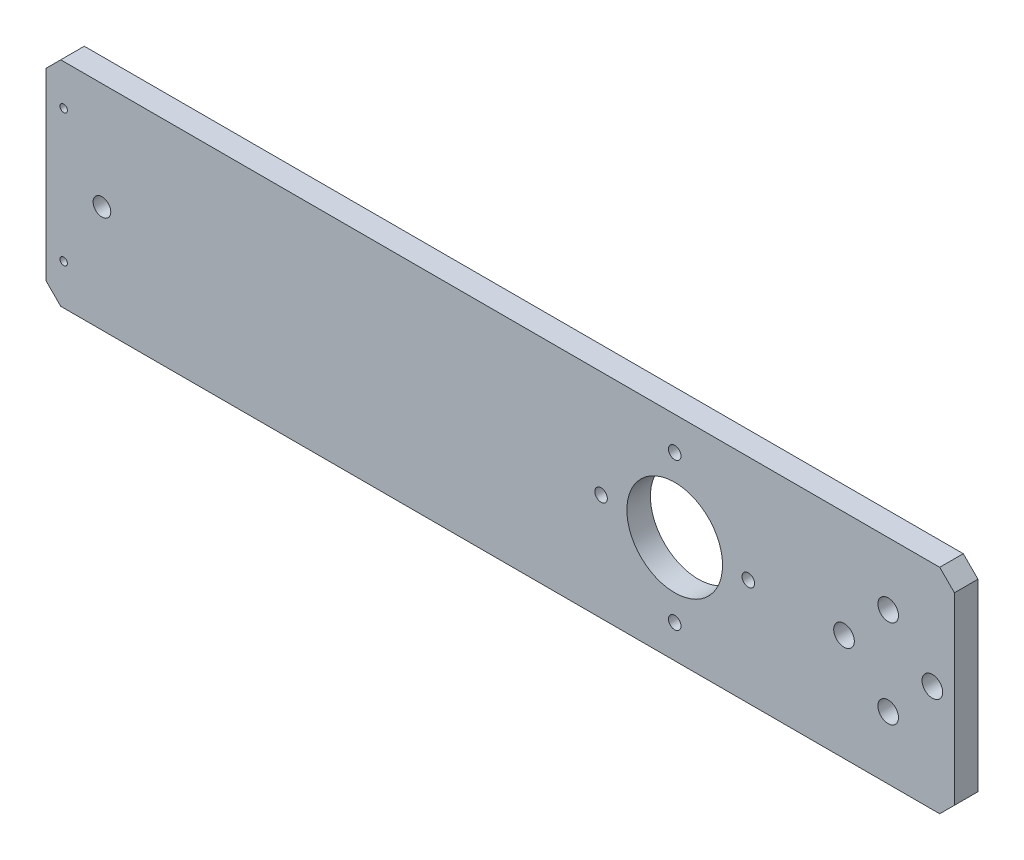
ISO-10303-21;
HEADER;
FILE_DESCRIPTION(('STEP AP214'),'2;1');
FILE_NAME('part.step','',(''),(''),'','','');
FILE_SCHEMA(('AUTOMOTIVE_DESIGN { 1 0 10303 214 1 1 1 1 }'));
ENDSEC;
DATA;
#1=APPLICATION_CONTEXT('core data for automotive mechanical design processes');
#2=APPLICATION_PROTOCOL_DEFINITION('international standard','automotive_design',2000,#1);
#3=PRODUCT_CONTEXT('',#1,'mechanical');
#4=PRODUCT('Part','Part','',(#3));
#5=PRODUCT_RELATED_PRODUCT_CATEGORY('part','',(#4));
#6=PRODUCT_DEFINITION_FORMATION('','',#4);
#7=PRODUCT_DEFINITION_CONTEXT('part definition',#1,'design');
#8=PRODUCT_DEFINITION('design','',#6,#7);
#9=PRODUCT_DEFINITION_SHAPE('','',#8);
#10=(LENGTH_UNIT() NAMED_UNIT(*) SI_UNIT(.MILLI.,.METRE.));
#11=(NAMED_UNIT(*) PLANE_ANGLE_UNIT() SI_UNIT($,.RADIAN.));
#12=(NAMED_UNIT(*) SI_UNIT($,.STERADIAN.) SOLID_ANGLE_UNIT());
#13=UNCERTAINTY_MEASURE_WITH_UNIT(LENGTH_MEASURE(1.E-05),#10,'distance_accuracy_value','');
#14=(GEOMETRIC_REPRESENTATION_CONTEXT(3) GLOBAL_UNCERTAINTY_ASSIGNED_CONTEXT((#13)) GLOBAL_UNIT_ASSIGNED_CONTEXT((#10,
#11,#12)) REPRESENTATION_CONTEXT('',''));
#15=CARTESIAN_POINT('',(0.,0.,0.));
#16=DIRECTION('',(0.,0.,1.));
#17=DIRECTION('',(1.,0.,0.));
#18=AXIS2_PLACEMENT_3D('',#15,#16,#17);
#19=CARTESIAN_POINT('',(575.187566056447,817.177968159028,16.));
#20=DIRECTION('',(0.,0.,1.));
#21=DIRECTION('',(1.,0.,0.));
#22=AXIS2_PLACEMENT_3D('',#19,#20,#21);
#23=PLANE('',#22);
#24=CARTESIAN_POINT('',(1014.68756605645,817.177968158969,16.));
#25=DIRECTION('',(0.,0.,1.));
#26=DIRECTION('',(1.,0.,0.));
#27=AXIS2_PLACEMENT_3D('',#24,#25,#26);
#28=CIRCLE('',#27,4.25000000000009);
#29=CARTESIAN_POINT('',(1018.93756605645,817.177968158969,16.));
#30=VERTEX_POINT('',#29);
#31=EDGE_CURVE('E187',#30,#30,#28,.T.);
#32=ORIENTED_EDGE('',*,*,#31,.F.);
#33=EDGE_LOOP('',(#32));
#34=FACE_BOUND('',#33,.T.);
#35=CARTESIAN_POINT('',(1064.68756605645,767.177968158969,16.));
#36=DIRECTION('',(0.,0.,1.));
#37=DIRECTION('',(1.,0.,0.));
#38=AXIS2_PLACEMENT_3D('',#35,#36,#37);
#39=CIRCLE('',#38,4.25000000000009);
#40=CARTESIAN_POINT('',(1068.93756605645,767.177968158969,16.));
#41=VERTEX_POINT('',#40);
#42=EDGE_CURVE('E177',#41,#41,#39,.T.);
#43=ORIENTED_EDGE('',*,*,#42,.F.);
#44=EDGE_LOOP('',(#43));
#45=FACE_BOUND('',#44,.T.);
#46=CARTESIAN_POINT('',(1114.68756605645,817.177968158969,16.));
#47=DIRECTION('',(0.,0.,1.));
#48=DIRECTION('',(1.,0.,0.));
#49=AXIS2_PLACEMENT_3D('',#46,#47,#48);
#50=CIRCLE('',#49,4.25000000000009);
#51=CARTESIAN_POINT('',(1118.93756605645,817.177968158969,16.));
#52=VERTEX_POINT('',#51);
#53=EDGE_CURVE('E174',#52,#52,#50,.T.);
#54=ORIENTED_EDGE('',*,*,#53,.F.);
#55=EDGE_LOOP('',(#54));
#56=FACE_BOUND('',#55,.T.);
#57=CARTESIAN_POINT('',(1064.68756605645,867.177968158969,16.));
#58=DIRECTION('',(0.,0.,1.));
#59=DIRECTION('',(1.,0.,0.));
#60=AXIS2_PLACEMENT_3D('',#57,#58,#59);
#61=CIRCLE('',#60,4.25000000000009);
#62=CARTESIAN_POINT('',(1068.93756605645,867.177968158969,16.));
#63=VERTEX_POINT('',#62);
#64=EDGE_CURVE('E171',#63,#63,#61,.T.);
#65=ORIENTED_EDGE('',*,*,#64,.F.);
#66=EDGE_LOOP('',(#65));
#67=FACE_BOUND('',#66,.T.);
#68=CARTESIAN_POINT('',(649.687566056466,772.177968159026,16.));
#69=DIRECTION('',(0.,0.,1.));
#70=DIRECTION('',(1.,0.,0.));
#71=AXIS2_PLACEMENT_3D('',#68,#69,#70);
#72=CIRCLE('',#71,2.49999999999995);
#73=CARTESIAN_POINT('',(652.187566056466,772.177968159026,16.));
#74=VERTEX_POINT('',#73);
#75=EDGE_CURVE('E194',#74,#74,#72,.T.);
#76=ORIENTED_EDGE('',*,*,#75,.F.);
#77=EDGE_LOOP('',(#76));
#78=FACE_BOUND('',#77,.T.);
#79=CARTESIAN_POINT('',(649.687566056466,862.177968159026,16.));
#80=DIRECTION('',(0.,0.,1.));
#81=DIRECTION('',(1.,0.,0.));
#82=AXIS2_PLACEMENT_3D('',#79,#80,#81);
#83=CIRCLE('',#82,2.49999999999995);
#84=CARTESIAN_POINT('',(652.187566056466,862.177968159026,16.));
#85=VERTEX_POINT('',#84);
#86=EDGE_CURVE('E200',#85,#85,#83,.T.);
#87=ORIENTED_EDGE('',*,*,#86,.F.);
#88=EDGE_LOOP('',(#87));
#89=FACE_BOUND('',#88,.T.);
#90=CARTESIAN_POINT('',(675.687566056447,817.177968158968,16.));
#91=DIRECTION('',(0.,0.,1.));
#92=DIRECTION('',(1.,0.,0.));
#93=AXIS2_PLACEMENT_3D('',#90,#91,#92);
#94=CIRCLE('',#93,6.00000000000001);
#95=CARTESIAN_POINT('',(681.687566056447,817.177968158968,16.));
#96=VERTEX_POINT('',#95);
#97=EDGE_CURVE('E166',#96,#96,#94,.T.);
#98=ORIENTED_EDGE('',*,*,#97,.F.);
#99=EDGE_LOOP('',(#98));
#100=FACE_BOUND('',#99,.T.);
#101=CARTESIAN_POINT('',(1179.68756605645,817.177968158969,16.));
#102=DIRECTION('',(0.,0.,1.));
#103=DIRECTION('',(1.,0.,0.));
#104=AXIS2_PLACEMENT_3D('',#101,#102,#103);
#105=CIRCLE('',#104,6.9999999999999);
#106=CARTESIAN_POINT('',(1186.68756605645,817.177968158969,16.));
#107=VERTEX_POINT('',#106);
#108=EDGE_CURVE('E211',#107,#107,#105,.T.);
#109=ORIENTED_EDGE('',*,*,#108,.F.);
#110=EDGE_LOOP('',(#109));
#111=FACE_BOUND('',#110,.T.);
#112=DIRECTION('',(-0.707106781186547,-0.707106781186547,0.));
#113=VECTOR('',#112,1.);
#114=CARTESIAN_POINT('',(647.687566056447,889.677968159028,16.));
#115=LINE('',#114,#113);
#116=CARTESIAN_POINT('',(647.687566056447,889.677968159028,16.));
#117=VERTEX_POINT('',#116);
#118=CARTESIAN_POINT('',(637.687566056447,879.677968159028,16.));
#119=VERTEX_POINT('',#118);
#120=EDGE_CURVE('E150',#117,#119,#115,.T.);
#121=ORIENTED_EDGE('',*,*,#120,.T.);
#122=DIRECTION('',(0.,-1.,0.));
#123=VECTOR('',#122,1.);
#124=CARTESIAN_POINT('',(637.687566056447,879.677968159028,16.));
#125=LINE('',#124,#123);
#126=CARTESIAN_POINT('',(637.687566056447,754.677968159028,16.));
#127=VERTEX_POINT('',#126);
#128=EDGE_CURVE('E98',#119,#127,#125,.T.);
#129=ORIENTED_EDGE('',*,*,#128,.T.);
#130=DIRECTION('',(0.707106781186547,-0.707106781186547,0.));
#131=VECTOR('',#130,1.);
#132=CARTESIAN_POINT('',(637.687566056447,754.677968159028,16.));
#133=LINE('',#132,#131);
#134=CARTESIAN_POINT('',(647.687566056447,744.677968159028,16.));
#135=VERTEX_POINT('',#134);
#136=EDGE_CURVE('E235',#127,#135,#133,.T.);
#137=ORIENTED_EDGE('',*,*,#136,.T.);
#138=DIRECTION('',(1.,0.,0.));
#139=VECTOR('',#138,1.);
#140=CARTESIAN_POINT('',(647.687566056447,744.677968159028,16.));
#141=LINE('',#140,#139);
#142=CARTESIAN_POINT('',(1244.68756605645,744.677968159028,16.));
#143=VERTEX_POINT('',#142);
#144=EDGE_CURVE('E237',#135,#143,#141,.T.);
#145=ORIENTED_EDGE('',*,*,#144,.T.);
#146=DIRECTION('',(0.707106781186547,0.707106781186547,0.));
#147=VECTOR('',#146,1.);
#148=CARTESIAN_POINT('',(1244.68756605645,744.677968159028,16.));
#149=LINE('',#148,#147);
#150=CARTESIAN_POINT('',(1254.68756605645,754.677968159028,16.));
#151=VERTEX_POINT('',#150);
#152=EDGE_CURVE('E117',#143,#151,#149,.T.);
#153=ORIENTED_EDGE('',*,*,#152,.T.);
#154=DIRECTION('',(0.,1.,0.));
#155=VECTOR('',#154,1.);
#156=CARTESIAN_POINT('',(1254.68756605645,754.677968159028,16.));
#157=LINE('',#156,#155);
#158=CARTESIAN_POINT('',(1254.68756605645,879.677968159028,16.));
#159=VERTEX_POINT('',#158);
#160=EDGE_CURVE('E111',#151,#159,#157,.T.);
#161=ORIENTED_EDGE('',*,*,#160,.T.);
#162=DIRECTION('',(-0.707106781186547,0.707106781186547,0.));
#163=VECTOR('',#162,1.);
#164=CARTESIAN_POINT('',(1254.68756605645,879.677968159028,16.));
#165=LINE('',#164,#163);
#166=CARTESIAN_POINT('',(1244.68756605645,889.677968159028,16.));
#167=VERTEX_POINT('',#166);
#168=EDGE_CURVE('E115',#159,#167,#165,.T.);
#169=ORIENTED_EDGE('',*,*,#168,.T.);
#170=DIRECTION('',(-1.,0.,0.));
#171=VECTOR('',#170,1.);
#172=CARTESIAN_POINT('',(1244.68756605645,889.677968159028,16.));
#173=LINE('',#172,#171);
#174=EDGE_CURVE('E55',#167,#117,#173,.T.);
#175=ORIENTED_EDGE('',*,*,#174,.T.);
#176=EDGE_LOOP('',(#121,#129,#137,#145,#153,#161,#169,#175));
#177=FACE_BOUND('',#176,.T.);
#178=CARTESIAN_POINT('',(1209.68756605645,787.177968158969,16.));
#179=DIRECTION('',(0.,0.,1.));
#180=DIRECTION('',(1.,0.,0.));
#181=AXIS2_PLACEMENT_3D('',#178,#179,#180);
#182=CIRCLE('',#181,6.9999999999999);
#183=CARTESIAN_POINT('',(1216.68756605645,787.177968158969,16.));
#184=VERTEX_POINT('',#183);
#185=EDGE_CURVE('E139',#184,#184,#182,.T.);
#186=ORIENTED_EDGE('',*,*,#185,.F.);
#187=EDGE_LOOP('',(#186));
#188=FACE_BOUND('',#187,.T.);
#189=CARTESIAN_POINT('',(1064.68756605645,817.177968158969,16.));
#190=DIRECTION('',(0.,0.,1.));
#191=DIRECTION('',(1.,0.,0.));
#192=AXIS2_PLACEMENT_3D('',#189,#190,#191);
#193=CIRCLE('',#192,32.5);
#194=CARTESIAN_POINT('',(1097.18756605645,817.177968158969,16.));
#195=VERTEX_POINT('',#194);
#196=EDGE_CURVE('E223',#195,#195,#193,.T.);
#197=ORIENTED_EDGE('',*,*,#196,.F.);
#198=EDGE_LOOP('',(#197));
#199=FACE_BOUND('',#198,.T.);
#200=CARTESIAN_POINT('',(1239.68756605645,817.177968158969,16.));
#201=DIRECTION('',(0.,0.,1.));
#202=DIRECTION('',(1.,0.,0.));
#203=AXIS2_PLACEMENT_3D('',#200,#201,#202);
#204=CIRCLE('',#203,6.9999999999999);
#205=CARTESIAN_POINT('',(1246.68756605645,817.177968158969,16.));
#206=VERTEX_POINT('',#205);
#207=EDGE_CURVE('E217',#206,#206,#204,.T.);
#208=ORIENTED_EDGE('',*,*,#207,.F.);
#209=EDGE_LOOP('',(#208));
#210=FACE_BOUND('',#209,.T.);
#211=CARTESIAN_POINT('',(1209.68756605645,847.177968158969,16.));
#212=DIRECTION('',(0.,0.,1.));
#213=DIRECTION('',(1.,0.,0.));
#214=AXIS2_PLACEMENT_3D('',#211,#212,#213);
#215=CIRCLE('',#214,6.9999999999999);
#216=CARTESIAN_POINT('',(1216.68756605645,847.177968158969,16.));
#217=VERTEX_POINT('',#216);
#218=EDGE_CURVE('E205',#217,#217,#215,.T.);
#219=ORIENTED_EDGE('',*,*,#218,.F.);
#220=EDGE_LOOP('',(#219));
#221=FACE_BOUND('',#220,.T.);
#222=ADVANCED_FACE('F36',(#34,#45,#56,#67,#78,#89,#100,#111,#177,#188,#199,#210,#221),#23,.T.);
#223=CARTESIAN_POINT('',(575.187566056447,817.177968159028,0.));
#224=DIRECTION('',(0.,0.,1.));
#225=DIRECTION('',(1.,0.,0.));
#226=AXIS2_PLACEMENT_3D('',#223,#224,#225);
#227=PLANE('',#226);
#228=CARTESIAN_POINT('',(1014.68756605645,817.177968158969,0.));
#229=DIRECTION('',(0.,0.,1.));
#230=DIRECTION('',(1.,0.,0.));
#231=AXIS2_PLACEMENT_3D('',#228,#229,#230);
#232=CIRCLE('',#231,4.25000000000009);
#233=CARTESIAN_POINT('',(1018.93756605645,817.177968158969,0.));
#234=VERTEX_POINT('',#233);
#235=EDGE_CURVE('E40',#234,#234,#232,.T.);
#236=ORIENTED_EDGE('',*,*,#235,.T.);
#237=EDGE_LOOP('',(#236));
#238=FACE_BOUND('',#237,.T.);
#239=CARTESIAN_POINT('',(1064.68756605645,767.177968158969,0.));
#240=DIRECTION('',(0.,0.,1.));
#241=DIRECTION('',(1.,0.,0.));
#242=AXIS2_PLACEMENT_3D('',#239,#240,#241);
#243=CIRCLE('',#242,4.25000000000009);
#244=CARTESIAN_POINT('',(1068.93756605645,767.177968158969,0.));
#245=VERTEX_POINT('',#244);
#246=EDGE_CURVE('E175',#245,#245,#243,.T.);
#247=ORIENTED_EDGE('',*,*,#246,.T.);
#248=EDGE_LOOP('',(#247));
#249=FACE_BOUND('',#248,.T.);
#250=CARTESIAN_POINT('',(1114.68756605645,817.177968158969,0.));
#251=DIRECTION('',(0.,0.,1.));
#252=DIRECTION('',(1.,0.,0.));
#253=AXIS2_PLACEMENT_3D('',#250,#251,#252);
#254=CIRCLE('',#253,4.25000000000009);
#255=CARTESIAN_POINT('',(1118.93756605645,817.177968158969,0.));
#256=VERTEX_POINT('',#255);
#257=EDGE_CURVE('E172',#256,#256,#254,.T.);
#258=ORIENTED_EDGE('',*,*,#257,.T.);
#259=EDGE_LOOP('',(#258));
#260=FACE_BOUND('',#259,.T.);
#261=CARTESIAN_POINT('',(1064.68756605645,867.177968158969,0.));
#262=DIRECTION('',(0.,0.,1.));
#263=DIRECTION('',(1.,0.,0.));
#264=AXIS2_PLACEMENT_3D('',#261,#262,#263);
#265=CIRCLE('',#264,4.25000000000009);
#266=CARTESIAN_POINT('',(1068.93756605645,867.177968158969,0.));
#267=VERTEX_POINT('',#266);
#268=EDGE_CURVE('E167',#267,#267,#265,.T.);
#269=ORIENTED_EDGE('',*,*,#268,.T.);
#270=EDGE_LOOP('',(#269));
#271=FACE_BOUND('',#270,.T.);
#272=CARTESIAN_POINT('',(649.687566056466,772.177968159026,0.));
#273=DIRECTION('',(0.,0.,-1.));
#274=DIRECTION('',(-1.,0.,0.));
#275=AXIS2_PLACEMENT_3D('',#272,#273,#274);
#276=CIRCLE('',#275,2.49999999999995);
#277=CARTESIAN_POINT('',(647.187566056466,772.177968159026,0.));
#278=VERTEX_POINT('',#277);
#279=EDGE_CURVE('E170',#278,#278,#276,.T.);
#280=ORIENTED_EDGE('',*,*,#279,.F.);
#281=EDGE_LOOP('',(#280));
#282=FACE_BOUND('',#281,.T.);
#283=CARTESIAN_POINT('',(649.687566056466,862.177968159026,0.));
#284=DIRECTION('',(0.,0.,-1.));
#285=DIRECTION('',(-1.,0.,0.));
#286=AXIS2_PLACEMENT_3D('',#283,#284,#285);
#287=CIRCLE('',#286,2.49999999999995);
#288=CARTESIAN_POINT('',(647.187566056466,862.177968159026,0.));
#289=VERTEX_POINT('',#288);
#290=EDGE_CURVE('E197',#289,#289,#287,.T.);
#291=ORIENTED_EDGE('',*,*,#290,.F.);
#292=EDGE_LOOP('',(#291));
#293=FACE_BOUND('',#292,.T.);
#294=CARTESIAN_POINT('',(675.687566056447,817.177968158968,0.));
#295=DIRECTION('',(0.,0.,1.));
#296=DIRECTION('',(1.,0.,0.));
#297=AXIS2_PLACEMENT_3D('',#294,#295,#296);
#298=CIRCLE('',#297,6.00000000000001);
#299=CARTESIAN_POINT('',(681.687566056447,817.177968158968,0.));
#300=VERTEX_POINT('',#299);
#301=EDGE_CURVE('E162',#300,#300,#298,.T.);
#302=ORIENTED_EDGE('',*,*,#301,.T.);
#303=EDGE_LOOP('',(#302));
#304=FACE_BOUND('',#303,.T.);
#305=CARTESIAN_POINT('',(1179.68756605645,817.177968158969,0.));
#306=DIRECTION('',(0.,0.,1.));
#307=DIRECTION('',(1.,0.,0.));
#308=AXIS2_PLACEMENT_3D('',#305,#306,#307);
#309=CIRCLE('',#308,6.9999999999999);
#310=CARTESIAN_POINT('',(1186.68756605645,817.177968158969,0.));
#311=VERTEX_POINT('',#310);
#312=EDGE_CURVE('E208',#311,#311,#309,.T.);
#313=ORIENTED_EDGE('',*,*,#312,.T.);
#314=EDGE_LOOP('',(#313));
#315=FACE_BOUND('',#314,.T.);
#316=DIRECTION('',(-0.707106781186547,-0.707106781186547,0.));
#317=VECTOR('',#316,1.);
#318=CARTESIAN_POINT('',(647.687566056447,889.677968159028,0.));
#319=LINE('',#318,#317);
#320=CARTESIAN_POINT('',(647.687566056447,889.677968159028,0.));
#321=VERTEX_POINT('',#320);
#322=CARTESIAN_POINT('',(637.687566056447,879.677968159028,0.));
#323=VERTEX_POINT('',#322);
#324=EDGE_CURVE('E135',#321,#323,#319,.T.);
#325=ORIENTED_EDGE('',*,*,#324,.F.);
#326=DIRECTION('',(-1.,0.,0.));
#327=VECTOR('',#326,1.);
#328=CARTESIAN_POINT('',(1244.68756605645,889.677968159028,0.));
#329=LINE('',#328,#327);
#330=CARTESIAN_POINT('',(1244.68756605645,889.677968159028,0.));
#331=VERTEX_POINT('',#330);
#332=EDGE_CURVE('E90',#331,#321,#329,.T.);
#333=ORIENTED_EDGE('',*,*,#332,.F.);
#334=DIRECTION('',(-0.707106781186547,0.707106781186547,0.));
#335=VECTOR('',#334,1.);
#336=CARTESIAN_POINT('',(1254.68756605645,879.677968159028,0.));
#337=LINE('',#336,#335);
#338=CARTESIAN_POINT('',(1254.68756605645,879.677968159028,0.));
#339=VERTEX_POINT('',#338);
#340=EDGE_CURVE('E84',#339,#331,#337,.T.);
#341=ORIENTED_EDGE('',*,*,#340,.F.);
#342=DIRECTION('',(0.,1.,0.));
#343=VECTOR('',#342,1.);
#344=CARTESIAN_POINT('',(1254.68756605645,754.677968159028,0.));
#345=LINE('',#344,#343);
#346=CARTESIAN_POINT('',(1254.68756605645,754.677968159028,0.));
#347=VERTEX_POINT('',#346);
#348=EDGE_CURVE('E125',#347,#339,#345,.T.);
#349=ORIENTED_EDGE('',*,*,#348,.F.);
#350=DIRECTION('',(0.707106781186547,0.707106781186547,0.));
#351=VECTOR('',#350,1.);
#352=CARTESIAN_POINT('',(1244.68756605645,744.677968159028,0.));
#353=LINE('',#352,#351);
#354=CARTESIAN_POINT('',(1244.68756605645,744.677968159028,0.));
#355=VERTEX_POINT('',#354);
#356=EDGE_CURVE('E145',#355,#347,#353,.T.);
#357=ORIENTED_EDGE('',*,*,#356,.F.);
#358=DIRECTION('',(1.,0.,0.));
#359=VECTOR('',#358,1.);
#360=CARTESIAN_POINT('',(647.687566056447,744.677968159028,0.));
#361=LINE('',#360,#359);
#362=CARTESIAN_POINT('',(647.687566056447,744.677968159028,0.));
#363=VERTEX_POINT('',#362);
#364=EDGE_CURVE('E143',#363,#355,#361,.T.);
#365=ORIENTED_EDGE('',*,*,#364,.F.);
#366=DIRECTION('',(0.707106781186547,-0.707106781186547,0.));
#367=VECTOR('',#366,1.);
#368=CARTESIAN_POINT('',(637.687566056447,754.677968159028,0.));
#369=LINE('',#368,#367);
#370=CARTESIAN_POINT('',(637.687566056447,754.677968159028,0.));
#371=VERTEX_POINT('',#370);
#372=EDGE_CURVE('E141',#371,#363,#369,.T.);
#373=ORIENTED_EDGE('',*,*,#372,.F.);
#374=DIRECTION('',(0.,-1.,0.));
#375=VECTOR('',#374,1.);
#376=CARTESIAN_POINT('',(637.687566056447,879.677968159028,0.));
#377=LINE('',#376,#375);
#378=EDGE_CURVE('E138',#323,#371,#377,.T.);
#379=ORIENTED_EDGE('',*,*,#378,.F.);
#380=EDGE_LOOP('',(#325,#333,#341,#349,#357,#365,#373,#379));
#381=FACE_BOUND('',#380,.T.);
#382=CARTESIAN_POINT('',(1209.68756605645,787.177968158969,0.));
#383=DIRECTION('',(0.,0.,1.));
#384=DIRECTION('',(1.,0.,0.));
#385=AXIS2_PLACEMENT_3D('',#382,#383,#384);
#386=CIRCLE('',#385,6.9999999999999);
#387=CARTESIAN_POINT('',(1216.68756605645,787.177968158969,0.));
#388=VERTEX_POINT('',#387);
#389=EDGE_CURVE('E226',#388,#388,#386,.T.);
#390=ORIENTED_EDGE('',*,*,#389,.T.);
#391=EDGE_LOOP('',(#390));
#392=FACE_BOUND('',#391,.T.);
#393=CARTESIAN_POINT('',(1064.68756605645,817.177968158969,0.));
#394=DIRECTION('',(0.,0.,1.));
#395=DIRECTION('',(1.,0.,0.));
#396=AXIS2_PLACEMENT_3D('',#393,#394,#395);
#397=CIRCLE('',#396,32.5);
#398=CARTESIAN_POINT('',(1097.18756605645,817.177968158969,0.));
#399=VERTEX_POINT('',#398);
#400=EDGE_CURVE('E220',#399,#399,#397,.T.);
#401=ORIENTED_EDGE('',*,*,#400,.T.);
#402=EDGE_LOOP('',(#401));
#403=FACE_BOUND('',#402,.T.);
#404=CARTESIAN_POINT('',(1239.68756605645,817.177968158969,0.));
#405=DIRECTION('',(0.,0.,1.));
#406=DIRECTION('',(1.,0.,0.));
#407=AXIS2_PLACEMENT_3D('',#404,#405,#406);
#408=CIRCLE('',#407,6.9999999999999);
#409=CARTESIAN_POINT('',(1246.68756605645,817.177968158969,0.));
#410=VERTEX_POINT('',#409);
#411=EDGE_CURVE('E214',#410,#410,#408,.T.);
#412=ORIENTED_EDGE('',*,*,#411,.T.);
#413=EDGE_LOOP('',(#412));
#414=FACE_BOUND('',#413,.T.);
#415=CARTESIAN_POINT('',(1209.68756605645,847.177968158969,0.));
#416=DIRECTION('',(0.,0.,1.));
#417=DIRECTION('',(1.,0.,0.));
#418=AXIS2_PLACEMENT_3D('',#415,#416,#417);
#419=CIRCLE('',#418,6.9999999999999);
#420=CARTESIAN_POINT('',(1216.68756605645,847.177968158969,0.));
#421=VERTEX_POINT('',#420);
#422=EDGE_CURVE('E165',#421,#421,#419,.T.);
#423=ORIENTED_EDGE('',*,*,#422,.T.);
#424=EDGE_LOOP('',(#423));
#425=FACE_BOUND('',#424,.T.);
#426=ADVANCED_FACE('F250',(#238,#249,#260,#271,#282,#293,#304,#315,#381,#392,#403,#414,#425),
#227,.F.);
#427=CARTESIAN_POINT('',(647.687566056447,889.677968159028,16.));
#428=DIRECTION('',(0.707106781186547,-0.707106781186547,0.));
#429=DIRECTION('',(0.707106781186548,0.707106781186548,0.));
#430=AXIS2_PLACEMENT_3D('',#427,#428,#429);
#431=PLANE('',#430);
#432=ORIENTED_EDGE('',*,*,#324,.T.);
#433=DIRECTION('',(0.,0.,-1.));
#434=VECTOR('',#433,1.);
#435=CARTESIAN_POINT('',(637.687566056447,879.677968159028,16.));
#436=LINE('',#435,#434);
#437=EDGE_CURVE('E11',#119,#323,#436,.T.);
#438=ORIENTED_EDGE('',*,*,#437,.F.);
#439=ORIENTED_EDGE('',*,*,#120,.F.);
#440=DIRECTION('',(0.,0.,-1.));
#441=VECTOR('',#440,1.);
#442=CARTESIAN_POINT('',(647.687566056447,889.677968159028,16.));
#443=LINE('',#442,#441);
#444=EDGE_CURVE('E131',#117,#321,#443,.T.);
#445=ORIENTED_EDGE('',*,*,#444,.T.);
#446=EDGE_LOOP('',(#432,#438,#439,#445));
#447=FACE_BOUND('',#446,.T.);
#448=ADVANCED_FACE('F38',(#447),#431,.F.);
#449=CARTESIAN_POINT('',(637.687566056447,879.677968159028,16.));
#450=DIRECTION('',(1.,0.,0.));
#451=DIRECTION('',(0.,0.,-1.));
#452=AXIS2_PLACEMENT_3D('',#449,#450,#451);
#453=PLANE('',#452);
#454=ORIENTED_EDGE('',*,*,#378,.T.);
#455=DIRECTION('',(0.,0.,-1.));
#456=VECTOR('',#455,1.);
#457=CARTESIAN_POINT('',(637.687566056447,754.677968159028,16.));
#458=LINE('',#457,#456);
#459=EDGE_CURVE('E46',#127,#371,#458,.T.);
#460=ORIENTED_EDGE('',*,*,#459,.F.);
#461=ORIENTED_EDGE('',*,*,#128,.F.);
#462=ORIENTED_EDGE('',*,*,#437,.T.);
#463=EDGE_LOOP('',(#454,#460,#461,#462));
#464=FACE_BOUND('',#463,.T.);
#465=ADVANCED_FACE('F431',(#464),#453,.F.);
#466=CARTESIAN_POINT('',(637.687566056447,754.677968159028,16.));
#467=DIRECTION('',(0.707106781186547,0.707106781186547,0.));
#468=DIRECTION('',(-0.707106781186548,0.707106781186548,0.));
#469=AXIS2_PLACEMENT_3D('',#466,#467,#468);
#470=PLANE('',#469);
#471=ORIENTED_EDGE('',*,*,#372,.T.);
#472=DIRECTION('',(0.,0.,-1.));
#473=VECTOR('',#472,1.);
#474=CARTESIAN_POINT('',(647.687566056447,744.677968159028,16.));
#475=LINE('',#474,#473);
#476=EDGE_CURVE('E157',#135,#363,#475,.T.);
#477=ORIENTED_EDGE('',*,*,#476,.F.);
#478=ORIENTED_EDGE('',*,*,#136,.F.);
#479=ORIENTED_EDGE('',*,*,#459,.T.);
#480=EDGE_LOOP('',(#471,#477,#478,#479));
#481=FACE_BOUND('',#480,.T.);
#482=ADVANCED_FACE('F422',(#481),#470,.F.);
#483=CARTESIAN_POINT('',(647.687566056447,744.677968159028,16.));
#484=DIRECTION('',(0.,1.,0.));
#485=DIRECTION('',(0.,0.,1.));
#486=AXIS2_PLACEMENT_3D('',#483,#484,#485);
#487=PLANE('',#486);
#488=ORIENTED_EDGE('',*,*,#364,.T.);
#489=DIRECTION('',(0.,0.,-1.));
#490=VECTOR('',#489,1.);
#491=CARTESIAN_POINT('',(1244.68756605645,744.677968159028,16.));
#492=LINE('',#491,#490);
#493=EDGE_CURVE('E154',#143,#355,#492,.T.);
#494=ORIENTED_EDGE('',*,*,#493,.F.);
#495=ORIENTED_EDGE('',*,*,#144,.F.);
#496=ORIENTED_EDGE('',*,*,#476,.T.);
#497=EDGE_LOOP('',(#488,#494,#495,#496));
#498=FACE_BOUND('',#497,.T.);
#499=ADVANCED_FACE('F243',(#498),#487,.F.);
#500=CARTESIAN_POINT('',(1244.68756605645,744.677968159028,16.));
#501=DIRECTION('',(-0.707106781186547,0.707106781186547,0.));
#502=DIRECTION('',(-0.707106781186548,-0.707106781186548,0.));
#503=AXIS2_PLACEMENT_3D('',#500,#501,#502);
#504=PLANE('',#503);
#505=ORIENTED_EDGE('',*,*,#356,.T.);
#506=DIRECTION('',(0.,0.,-1.));
#507=VECTOR('',#506,1.);
#508=CARTESIAN_POINT('',(1254.68756605645,754.677968159028,16.));
#509=LINE('',#508,#507);
#510=EDGE_CURVE('E126',#151,#347,#509,.T.);
#511=ORIENTED_EDGE('',*,*,#510,.F.);
#512=ORIENTED_EDGE('',*,*,#152,.F.);
#513=ORIENTED_EDGE('',*,*,#493,.T.);
#514=EDGE_LOOP('',(#505,#511,#512,#513));
#515=FACE_BOUND('',#514,.T.);
#516=ADVANCED_FACE('F247',(#515),#504,.F.);
#517=CARTESIAN_POINT('',(1254.68756605645,754.677968159028,16.));
#518=DIRECTION('',(-1.,0.,0.));
#519=DIRECTION('',(0.,0.,1.));
#520=AXIS2_PLACEMENT_3D('',#517,#518,#519);
#521=PLANE('',#520);
#522=ORIENTED_EDGE('',*,*,#348,.T.);
#523=DIRECTION('',(0.,0.,-1.));
#524=VECTOR('',#523,1.);
#525=CARTESIAN_POINT('',(1254.68756605645,879.677968159028,16.));
#526=LINE('',#525,#524);
#527=EDGE_CURVE('E122',#159,#339,#526,.T.);
#528=ORIENTED_EDGE('',*,*,#527,.F.);
#529=ORIENTED_EDGE('',*,*,#160,.F.);
#530=ORIENTED_EDGE('',*,*,#510,.T.);
#531=EDGE_LOOP('',(#522,#528,#529,#530));
#532=FACE_BOUND('',#531,.T.);
#533=ADVANCED_FACE('F123',(#532),#521,.F.);
#534=CARTESIAN_POINT('',(1254.68756605645,879.677968159028,16.));
#535=DIRECTION('',(-0.707106781186547,-0.707106781186547,0.));
#536=DIRECTION('',(0.707106781186548,-0.707106781186548,0.));
#537=AXIS2_PLACEMENT_3D('',#534,#535,#536);
#538=PLANE('',#537);
#539=ORIENTED_EDGE('',*,*,#340,.T.);
#540=DIRECTION('',(0.,0.,-1.));
#541=VECTOR('',#540,1.);
#542=CARTESIAN_POINT('',(1244.68756605645,889.677968159028,16.));
#543=LINE('',#542,#541);
#544=EDGE_CURVE('E127',#167,#331,#543,.T.);
#545=ORIENTED_EDGE('',*,*,#544,.F.);
#546=ORIENTED_EDGE('',*,*,#168,.F.);
#547=ORIENTED_EDGE('',*,*,#527,.T.);
#548=EDGE_LOOP('',(#539,#545,#546,#547));
#549=FACE_BOUND('',#548,.T.);
#550=ADVANCED_FACE('F129',(#549),#538,.F.);
#551=CARTESIAN_POINT('',(1244.68756605645,889.677968159028,16.));
#552=DIRECTION('',(0.,-1.,0.));
#553=DIRECTION('',(0.,0.,-1.));
#554=AXIS2_PLACEMENT_3D('',#551,#552,#553);
#555=PLANE('',#554);
#556=ORIENTED_EDGE('',*,*,#332,.T.);
#557=ORIENTED_EDGE('',*,*,#444,.F.);
#558=ORIENTED_EDGE('',*,*,#174,.F.);
#559=ORIENTED_EDGE('',*,*,#544,.T.);
#560=EDGE_LOOP('',(#556,#557,#558,#559));
#561=FACE_BOUND('',#560,.T.);
#562=ADVANCED_FACE('F256',(#561),#555,.F.);
#563=CARTESIAN_POINT('',(1209.68756605645,787.177968158969,16.));
#564=DIRECTION('',(0.,0.,-1.));
#565=DIRECTION('',(-1.,0.,0.));
#566=AXIS2_PLACEMENT_3D('',#563,#564,#565);
#567=CYLINDRICAL_SURFACE('',#566,6.9999999999999);
#568=ORIENTED_EDGE('',*,*,#185,.T.);
#569=EDGE_LOOP('',(#568));
#570=FACE_BOUND('',#569,.T.);
#571=ORIENTED_EDGE('',*,*,#389,.F.);
#572=EDGE_LOOP('',(#571));
#573=FACE_BOUND('',#572,.T.);
#574=ADVANCED_FACE('F258',(#570,#573),#567,.F.);
#575=CARTESIAN_POINT('',(1064.68756605645,817.177968158969,16.));
#576=DIRECTION('',(0.,0.,-1.));
#577=DIRECTION('',(-1.,0.,0.));
#578=AXIS2_PLACEMENT_3D('',#575,#576,#577);
#579=CYLINDRICAL_SURFACE('',#578,32.5);
#580=ORIENTED_EDGE('',*,*,#196,.T.);
#581=EDGE_LOOP('',(#580));
#582=FACE_BOUND('',#581,.T.);
#583=ORIENTED_EDGE('',*,*,#400,.F.);
#584=EDGE_LOOP('',(#583));
#585=FACE_BOUND('',#584,.T.);
#586=ADVANCED_FACE('F264',(#582,#585),#579,.F.);
#587=CARTESIAN_POINT('',(1239.68756605645,817.177968158969,16.));
#588=DIRECTION('',(0.,0.,-1.));
#589=DIRECTION('',(-1.,0.,0.));
#590=AXIS2_PLACEMENT_3D('',#587,#588,#589);
#591=CYLINDRICAL_SURFACE('',#590,6.9999999999999);
#592=ORIENTED_EDGE('',*,*,#207,.T.);
#593=EDGE_LOOP('',(#592));
#594=FACE_BOUND('',#593,.T.);
#595=ORIENTED_EDGE('',*,*,#411,.F.);
#596=EDGE_LOOP('',(#595));
#597=FACE_BOUND('',#596,.T.);
#598=ADVANCED_FACE('F281',(#594,#597),#591,.F.);
#599=CARTESIAN_POINT('',(1179.68756605645,817.177968158969,16.));
#600=DIRECTION('',(0.,0.,-1.));
#601=DIRECTION('',(-1.,0.,0.));
#602=AXIS2_PLACEMENT_3D('',#599,#600,#601);
#603=CYLINDRICAL_SURFACE('',#602,6.9999999999999);
#604=ORIENTED_EDGE('',*,*,#108,.T.);
#605=EDGE_LOOP('',(#604));
#606=FACE_BOUND('',#605,.T.);
#607=ORIENTED_EDGE('',*,*,#312,.F.);
#608=EDGE_LOOP('',(#607));
#609=FACE_BOUND('',#608,.T.);
#610=ADVANCED_FACE('F285',(#606,#609),#603,.F.);
#611=CARTESIAN_POINT('',(1209.68756605645,847.177968158969,16.));
#612=DIRECTION('',(0.,0.,-1.));
#613=DIRECTION('',(-1.,0.,0.));
#614=AXIS2_PLACEMENT_3D('',#611,#612,#613);
#615=CYLINDRICAL_SURFACE('',#614,6.9999999999999);
#616=ORIENTED_EDGE('',*,*,#218,.T.);
#617=EDGE_LOOP('',(#616));
#618=FACE_BOUND('',#617,.T.);
#619=ORIENTED_EDGE('',*,*,#422,.F.);
#620=EDGE_LOOP('',(#619));
#621=FACE_BOUND('',#620,.T.);
#622=ADVANCED_FACE('F289',(#618,#621),#615,.F.);
#623=CARTESIAN_POINT('',(675.687566056447,817.177968158968,16.));
#624=DIRECTION('',(0.,0.,1.));
#625=DIRECTION('',(1.,0.,0.));
#626=AXIS2_PLACEMENT_3D('',#623,#624,#625);
#627=CYLINDRICAL_SURFACE('',#626,6.00000000000001);
#628=ORIENTED_EDGE('',*,*,#97,.T.);
#629=EDGE_LOOP('',(#628));
#630=FACE_BOUND('',#629,.T.);
#631=ORIENTED_EDGE('',*,*,#301,.F.);
#632=EDGE_LOOP('',(#631));
#633=FACE_BOUND('',#632,.T.);
#634=ADVANCED_FACE('F293',(#630,#633),#627,.F.);
#635=CARTESIAN_POINT('',(649.687566056466,862.177968159026,0.));
#636=DIRECTION('',(0.,0.,-1.));
#637=DIRECTION('',(-1.,0.,0.));
#638=AXIS2_PLACEMENT_3D('',#635,#636,#637);
#639=CYLINDRICAL_SURFACE('',#638,2.49999999999995);
#640=ORIENTED_EDGE('',*,*,#86,.T.);
#641=EDGE_LOOP('',(#640));
#642=FACE_BOUND('',#641,.T.);
#643=ORIENTED_EDGE('',*,*,#290,.T.);
#644=EDGE_LOOP('',(#643));
#645=FACE_BOUND('',#644,.T.);
#646=ADVANCED_FACE('F297',(#642,#645),#639,.F.);
#647=CARTESIAN_POINT('',(649.687566056466,772.177968159026,0.));
#648=DIRECTION('',(0.,0.,-1.));
#649=DIRECTION('',(-1.,0.,0.));
#650=AXIS2_PLACEMENT_3D('',#647,#648,#649);
#651=CYLINDRICAL_SURFACE('',#650,2.49999999999995);
#652=ORIENTED_EDGE('',*,*,#75,.T.);
#653=EDGE_LOOP('',(#652));
#654=FACE_BOUND('',#653,.T.);
#655=ORIENTED_EDGE('',*,*,#279,.T.);
#656=EDGE_LOOP('',(#655));
#657=FACE_BOUND('',#656,.T.);
#658=ADVANCED_FACE('F301',(#654,#657),#651,.F.);
#659=CARTESIAN_POINT('',(1064.68756605645,867.177968158969,16.));
#660=DIRECTION('',(0.,0.,1.));
#661=DIRECTION('',(1.,0.,0.));
#662=AXIS2_PLACEMENT_3D('',#659,#660,#661);
#663=CYLINDRICAL_SURFACE('',#662,4.25000000000009);
#664=ORIENTED_EDGE('',*,*,#64,.T.);
#665=EDGE_LOOP('',(#664));
#666=FACE_BOUND('',#665,.T.);
#667=ORIENTED_EDGE('',*,*,#268,.F.);
#668=EDGE_LOOP('',(#667));
#669=FACE_BOUND('',#668,.T.);
#670=ADVANCED_FACE('F305',(#666,#669),#663,.F.);
#671=CARTESIAN_POINT('',(1114.68756605645,817.177968158969,16.));
#672=DIRECTION('',(0.,0.,1.));
#673=DIRECTION('',(1.,0.,0.));
#674=AXIS2_PLACEMENT_3D('',#671,#672,#673);
#675=CYLINDRICAL_SURFACE('',#674,4.25000000000009);
#676=ORIENTED_EDGE('',*,*,#53,.T.);
#677=EDGE_LOOP('',(#676));
#678=FACE_BOUND('',#677,.T.);
#679=ORIENTED_EDGE('',*,*,#257,.F.);
#680=EDGE_LOOP('',(#679));
#681=FACE_BOUND('',#680,.T.);
#682=ADVANCED_FACE('F309',(#678,#681),#675,.F.);
#683=CARTESIAN_POINT('',(1064.68756605645,767.177968158969,16.));
#684=DIRECTION('',(0.,0.,1.));
#685=DIRECTION('',(1.,0.,0.));
#686=AXIS2_PLACEMENT_3D('',#683,#684,#685);
#687=CYLINDRICAL_SURFACE('',#686,4.25000000000009);
#688=ORIENTED_EDGE('',*,*,#42,.T.);
#689=EDGE_LOOP('',(#688));
#690=FACE_BOUND('',#689,.T.);
#691=ORIENTED_EDGE('',*,*,#246,.F.);
#692=EDGE_LOOP('',(#691));
#693=FACE_BOUND('',#692,.T.);
#694=ADVANCED_FACE('F313',(#690,#693),#687,.F.);
#695=CARTESIAN_POINT('',(1014.68756605645,817.177968158969,16.));
#696=DIRECTION('',(0.,0.,1.));
#697=DIRECTION('',(1.,0.,0.));
#698=AXIS2_PLACEMENT_3D('',#695,#696,#697);
#699=CYLINDRICAL_SURFACE('',#698,4.25000000000009);
#700=ORIENTED_EDGE('',*,*,#31,.T.);
#701=EDGE_LOOP('',(#700));
#702=FACE_BOUND('',#701,.T.);
#703=ORIENTED_EDGE('',*,*,#235,.F.);
#704=EDGE_LOOP('',(#703));
#705=FACE_BOUND('',#704,.T.);
#706=ADVANCED_FACE('F317',(#702,#705),#699,.F.);
#707=CLOSED_SHELL('',(#222,#426,#448,#465,#482,#499,#516,#533,#550,#562,#574,#586,#598,#610,
#622,#634,#646,#658,#670,#682,#694,#706));
#708=MANIFOLD_SOLID_BREP('B2',#707);
#709=ADVANCED_BREP_SHAPE_REPRESENTATION('',(#18,#708),#14);
#710=SHAPE_DEFINITION_REPRESENTATION(#9,#709);
ENDSEC;
END-ISO-10303-21;
